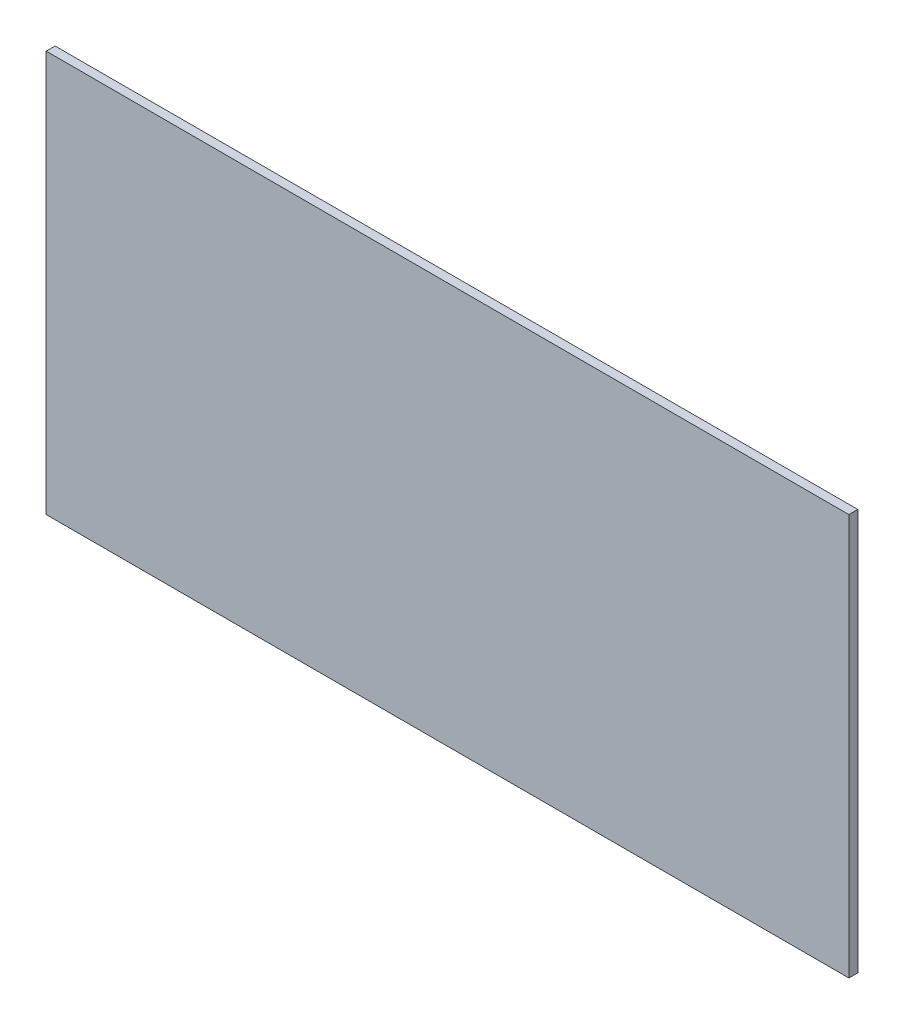
ISO-10303-21;
HEADER;
FILE_DESCRIPTION(('STEP AP214'),'2;1');
FILE_NAME('part.step','',(''),(''),'','','');
FILE_SCHEMA(('AUTOMOTIVE_DESIGN { 1 0 10303 214 1 1 1 1 }'));
ENDSEC;
DATA;
#1=APPLICATION_CONTEXT('core data for automotive mechanical design processes');
#2=APPLICATION_PROTOCOL_DEFINITION('international standard','automotive_design',2000,#1);
#3=PRODUCT_CONTEXT('',#1,'mechanical');
#4=PRODUCT('Part','Part','',(#3));
#5=PRODUCT_RELATED_PRODUCT_CATEGORY('part','',(#4));
#6=PRODUCT_DEFINITION_FORMATION('','',#4);
#7=PRODUCT_DEFINITION_CONTEXT('part definition',#1,'design');
#8=PRODUCT_DEFINITION('design','',#6,#7);
#9=PRODUCT_DEFINITION_SHAPE('','',#8);
#10=(LENGTH_UNIT() NAMED_UNIT(*) SI_UNIT(.MILLI.,.METRE.));
#11=(NAMED_UNIT(*) PLANE_ANGLE_UNIT() SI_UNIT($,.RADIAN.));
#12=(NAMED_UNIT(*) SI_UNIT($,.STERADIAN.) SOLID_ANGLE_UNIT());
#13=UNCERTAINTY_MEASURE_WITH_UNIT(LENGTH_MEASURE(1.E-05),#10,'distance_accuracy_value','');
#14=(GEOMETRIC_REPRESENTATION_CONTEXT(3) GLOBAL_UNCERTAINTY_ASSIGNED_CONTEXT((#13)) GLOBAL_UNIT_ASSIGNED_CONTEXT((#10,
#11,#12)) REPRESENTATION_CONTEXT('',''));
#15=CARTESIAN_POINT('',(0.,0.,0.));
#16=DIRECTION('',(0.,0.,1.));
#17=DIRECTION('',(1.,0.,0.));
#18=AXIS2_PLACEMENT_3D('',#15,#16,#17);
#19=CARTESIAN_POINT('',(90.,45.,1.));
#20=DIRECTION('',(-1.,0.,0.));
#21=DIRECTION('',(0.,-1.,0.));
#22=AXIS2_PLACEMENT_3D('',#19,#20,#21);
#23=PLANE('',#22);
#24=DIRECTION('',(0.,1.,0.));
#25=VECTOR('',#24,1.);
#26=CARTESIAN_POINT('',(90.,45.,-1.));
#27=LINE('',#26,#25);
#28=CARTESIAN_POINT('',(90.,-45.,-1.));
#29=VERTEX_POINT('',#28);
#30=CARTESIAN_POINT('',(90.,45.,-1.));
#31=VERTEX_POINT('',#30);
#32=EDGE_CURVE('E111',#29,#31,#27,.T.);
#33=ORIENTED_EDGE('',*,*,#32,.T.);
#34=DIRECTION('',(0.,0.,-1.));
#35=VECTOR('',#34,1.);
#36=CARTESIAN_POINT('',(90.,45.,1.));
#37=LINE('',#36,#35);
#38=CARTESIAN_POINT('',(90.,45.,1.));
#39=VERTEX_POINT('',#38);
#40=EDGE_CURVE('E11',#39,#31,#37,.T.);
#41=ORIENTED_EDGE('',*,*,#40,.F.);
#42=DIRECTION('',(0.,1.,0.));
#43=VECTOR('',#42,1.);
#44=CARTESIAN_POINT('',(90.,45.,1.));
#45=LINE('',#44,#43);
#46=CARTESIAN_POINT('',(90.,-45.,1.));
#47=VERTEX_POINT('',#46);
#48=EDGE_CURVE('E95',#47,#39,#45,.T.);
#49=ORIENTED_EDGE('',*,*,#48,.F.);
#50=DIRECTION('',(0.,0.,-1.));
#51=VECTOR('',#50,1.);
#52=CARTESIAN_POINT('',(90.,-45.,1.));
#53=LINE('',#52,#51);
#54=EDGE_CURVE('E107',#47,#29,#53,.T.);
#55=ORIENTED_EDGE('',*,*,#54,.T.);
#56=EDGE_LOOP('',(#33,#41,#49,#55));
#57=FACE_BOUND('',#56,.T.);
#58=ADVANCED_FACE('F43',(#57),#23,.F.);
#59=CARTESIAN_POINT('',(-90.,45.,1.));
#60=DIRECTION('',(0.,-1.,0.));
#61=DIRECTION('',(0.,0.,-1.));
#62=AXIS2_PLACEMENT_3D('',#59,#60,#61);
#63=PLANE('',#62);
#64=DIRECTION('',(-1.,0.,0.));
#65=VECTOR('',#64,1.);
#66=CARTESIAN_POINT('',(-90.,45.,-1.));
#67=LINE('',#66,#65);
#68=CARTESIAN_POINT('',(-90.,45.,-1.));
#69=VERTEX_POINT('',#68);
#70=EDGE_CURVE('E100',#31,#69,#67,.T.);
#71=ORIENTED_EDGE('',*,*,#70,.T.);
#72=DIRECTION('',(0.,0.,-1.));
#73=VECTOR('',#72,1.);
#74=CARTESIAN_POINT('',(-90.,45.,1.));
#75=LINE('',#74,#73);
#76=CARTESIAN_POINT('',(-90.,45.,1.));
#77=VERTEX_POINT('',#76);
#78=EDGE_CURVE('E52',#77,#69,#75,.T.);
#79=ORIENTED_EDGE('',*,*,#78,.F.);
#80=DIRECTION('',(-1.,0.,0.));
#81=VECTOR('',#80,1.);
#82=CARTESIAN_POINT('',(-90.,45.,1.));
#83=LINE('',#82,#81);
#84=EDGE_CURVE('E90',#39,#77,#83,.T.);
#85=ORIENTED_EDGE('',*,*,#84,.F.);
#86=ORIENTED_EDGE('',*,*,#40,.T.);
#87=EDGE_LOOP('',(#71,#79,#85,#86));
#88=FACE_BOUND('',#87,.T.);
#89=ADVANCED_FACE('F99',(#88),#63,.F.);
#90=CARTESIAN_POINT('',(-90.,45.,1.));
#91=DIRECTION('',(1.,0.,0.));
#92=DIRECTION('',(0.,1.,0.));
#93=AXIS2_PLACEMENT_3D('',#90,#91,#92);
#94=PLANE('',#93);
#95=DIRECTION('',(0.,-1.,0.));
#96=VECTOR('',#95,1.);
#97=CARTESIAN_POINT('',(-90.,45.,-1.));
#98=LINE('',#97,#96);
#99=CARTESIAN_POINT('',(-90.,-45.,-1.));
#100=VERTEX_POINT('',#99);
#101=EDGE_CURVE('E77',#69,#100,#98,.T.);
#102=ORIENTED_EDGE('',*,*,#101,.T.);
#103=DIRECTION('',(0.,0.,-1.));
#104=VECTOR('',#103,1.);
#105=CARTESIAN_POINT('',(-90.,-45.,1.));
#106=LINE('',#105,#104);
#107=CARTESIAN_POINT('',(-90.,-45.,1.));
#108=VERTEX_POINT('',#107);
#109=EDGE_CURVE('E102',#108,#100,#106,.T.);
#110=ORIENTED_EDGE('',*,*,#109,.F.);
#111=DIRECTION('',(0.,-1.,0.));
#112=VECTOR('',#111,1.);
#113=CARTESIAN_POINT('',(-90.,45.,1.));
#114=LINE('',#113,#112);
#115=EDGE_CURVE('E93',#77,#108,#114,.T.);
#116=ORIENTED_EDGE('',*,*,#115,.F.);
#117=ORIENTED_EDGE('',*,*,#78,.T.);
#118=EDGE_LOOP('',(#102,#110,#116,#117));
#119=FACE_BOUND('',#118,.T.);
#120=ADVANCED_FACE('F103',(#119),#94,.F.);
#121=CARTESIAN_POINT('',(-90.,-45.,1.));
#122=DIRECTION('',(0.,1.,0.));
#123=DIRECTION('',(0.,0.,1.));
#124=AXIS2_PLACEMENT_3D('',#121,#122,#123);
#125=PLANE('',#124);
#126=DIRECTION('',(1.,0.,0.));
#127=VECTOR('',#126,1.);
#128=CARTESIAN_POINT('',(-90.,-45.,-1.));
#129=LINE('',#128,#127);
#130=EDGE_CURVE('E83',#100,#29,#129,.T.);
#131=ORIENTED_EDGE('',*,*,#130,.T.);
#132=ORIENTED_EDGE('',*,*,#54,.F.);
#133=DIRECTION('',(1.,0.,0.));
#134=VECTOR('',#133,1.);
#135=CARTESIAN_POINT('',(-90.,-45.,1.));
#136=LINE('',#135,#134);
#137=EDGE_CURVE('E60',#108,#47,#136,.T.);
#138=ORIENTED_EDGE('',*,*,#137,.F.);
#139=ORIENTED_EDGE('',*,*,#109,.T.);
#140=EDGE_LOOP('',(#131,#132,#138,#139));
#141=FACE_BOUND('',#140,.T.);
#142=ADVANCED_FACE('F124',(#141),#125,.F.);
#143=CARTESIAN_POINT('',(0.,0.,1.));
#144=DIRECTION('',(0.,0.,1.));
#145=DIRECTION('',(1.,0.,0.));
#146=AXIS2_PLACEMENT_3D('',#143,#144,#145);
#147=PLANE('',#146);
#148=ORIENTED_EDGE('',*,*,#48,.T.);
#149=ORIENTED_EDGE('',*,*,#84,.T.);
#150=ORIENTED_EDGE('',*,*,#115,.T.);
#151=ORIENTED_EDGE('',*,*,#137,.T.);
#152=EDGE_LOOP('',(#148,#149,#150,#151));
#153=FACE_BOUND('',#152,.T.);
#154=ADVANCED_FACE('F91',(#153),#147,.T.);
#155=CARTESIAN_POINT('',(0.,0.,-1.));
#156=DIRECTION('',(0.,0.,1.));
#157=DIRECTION('',(1.,0.,0.));
#158=AXIS2_PLACEMENT_3D('',#155,#156,#157);
#159=PLANE('',#158);
#160=ORIENTED_EDGE('',*,*,#32,.F.);
#161=ORIENTED_EDGE('',*,*,#130,.F.);
#162=ORIENTED_EDGE('',*,*,#101,.F.);
#163=ORIENTED_EDGE('',*,*,#70,.F.);
#164=EDGE_LOOP('',(#160,#161,#162,#163));
#165=FACE_BOUND('',#164,.T.);
#166=ADVANCED_FACE('F127',(#165),#159,.F.);
#167=CLOSED_SHELL('',(#58,#89,#120,#142,#154,#166));
#168=MANIFOLD_SOLID_BREP('B2',#167);
#169=ADVANCED_BREP_SHAPE_REPRESENTATION('',(#18,#168),#14);
#170=SHAPE_DEFINITION_REPRESENTATION(#9,#169);
ENDSEC;
END-ISO-10303-21;
